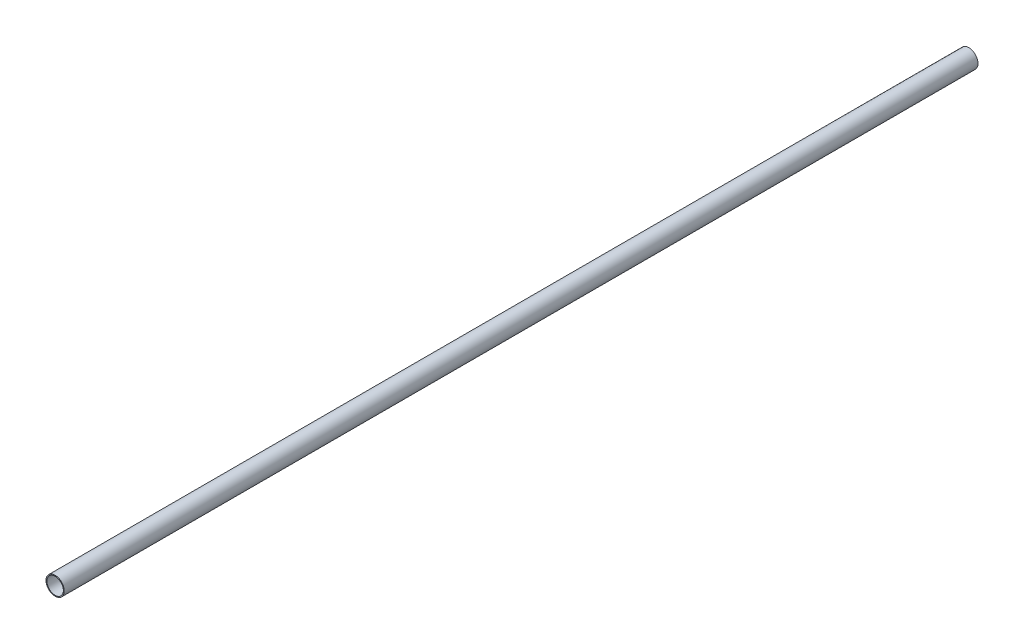
ISO-10303-21;
HEADER;
FILE_DESCRIPTION(('STEP AP214'),'2;1');
FILE_NAME('part.step','',(''),(''),'','','');
FILE_SCHEMA(('AUTOMOTIVE_DESIGN { 1 0 10303 214 1 1 1 1 }'));
ENDSEC;
DATA;
#1=APPLICATION_CONTEXT('core data for automotive mechanical design processes');
#2=APPLICATION_PROTOCOL_DEFINITION('international standard','automotive_design',2000,#1);
#3=PRODUCT_CONTEXT('',#1,'mechanical');
#4=PRODUCT('Part','Part','',(#3));
#5=PRODUCT_RELATED_PRODUCT_CATEGORY('part','',(#4));
#6=PRODUCT_DEFINITION_FORMATION('','',#4);
#7=PRODUCT_DEFINITION_CONTEXT('part definition',#1,'design');
#8=PRODUCT_DEFINITION('design','',#6,#7);
#9=PRODUCT_DEFINITION_SHAPE('','',#8);
#10=(LENGTH_UNIT() NAMED_UNIT(*) SI_UNIT(.MILLI.,.METRE.));
#11=(NAMED_UNIT(*) PLANE_ANGLE_UNIT() SI_UNIT($,.RADIAN.));
#12=(NAMED_UNIT(*) SI_UNIT($,.STERADIAN.) SOLID_ANGLE_UNIT());
#13=UNCERTAINTY_MEASURE_WITH_UNIT(LENGTH_MEASURE(1.E-05),#10,'distance_accuracy_value','');
#14=(GEOMETRIC_REPRESENTATION_CONTEXT(3) GLOBAL_UNCERTAINTY_ASSIGNED_CONTEXT((#13)) GLOBAL_UNIT_ASSIGNED_CONTEXT((#10,
#11,#12)) REPRESENTATION_CONTEXT('',''));
#15=CARTESIAN_POINT('',(0.,0.,0.));
#16=DIRECTION('',(0.,0.,1.));
#17=DIRECTION('',(1.,0.,0.));
#18=AXIS2_PLACEMENT_3D('',#15,#16,#17);
#19=CARTESIAN_POINT('',(0.,0.,1000.));
#20=DIRECTION('',(0.,0.,1.));
#21=DIRECTION('',(1.,0.,0.));
#22=AXIS2_PLACEMENT_3D('',#19,#20,#21);
#23=PLANE('',#22);
#24=CARTESIAN_POINT('',(0.,0.,1000.));
#25=DIRECTION('',(0.,0.,1.));
#26=DIRECTION('',(1.,0.,0.));
#27=AXIS2_PLACEMENT_3D('',#24,#25,#26);
#28=CIRCLE('',#27,10.);
#29=CARTESIAN_POINT('',(10.,0.,1000.));
#30=VERTEX_POINT('',#29);
#31=EDGE_CURVE('E10',#30,#30,#28,.T.);
#32=ORIENTED_EDGE('',*,*,#31,.T.);
#33=EDGE_LOOP('',(#32));
#34=FACE_BOUND('',#33,.T.);
#35=CARTESIAN_POINT('',(0.,0.,1000.));
#36=DIRECTION('',(0.,0.,1.));
#37=DIRECTION('',(1.,0.,0.));
#38=AXIS2_PLACEMENT_3D('',#35,#36,#37);
#39=CIRCLE('',#38,9.);
#40=CARTESIAN_POINT('',(9.,0.,1000.));
#41=VERTEX_POINT('',#40);
#42=EDGE_CURVE('E42',#41,#41,#39,.T.);
#43=ORIENTED_EDGE('',*,*,#42,.F.);
#44=EDGE_LOOP('',(#43));
#45=FACE_BOUND('',#44,.T.);
#46=ADVANCED_FACE('F31',(#34,#45),#23,.T.);
#47=CARTESIAN_POINT('',(0.,0.,0.));
#48=DIRECTION('',(0.,0.,1.));
#49=DIRECTION('',(1.,0.,0.));
#50=AXIS2_PLACEMENT_3D('',#47,#48,#49);
#51=PLANE('',#50);
#52=CARTESIAN_POINT('',(0.,0.,0.));
#53=DIRECTION('',(0.,0.,1.));
#54=DIRECTION('',(1.,0.,0.));
#55=AXIS2_PLACEMENT_3D('',#52,#53,#54);
#56=CIRCLE('',#55,10.);
#57=CARTESIAN_POINT('',(10.,0.,0.));
#58=VERTEX_POINT('',#57);
#59=EDGE_CURVE('E35',#58,#58,#56,.T.);
#60=ORIENTED_EDGE('',*,*,#59,.F.);
#61=EDGE_LOOP('',(#60));
#62=FACE_BOUND('',#61,.T.);
#63=CARTESIAN_POINT('',(0.,0.,0.));
#64=DIRECTION('',(0.,0.,1.));
#65=DIRECTION('',(1.,0.,0.));
#66=AXIS2_PLACEMENT_3D('',#63,#64,#65);
#67=CIRCLE('',#66,9.);
#68=CARTESIAN_POINT('',(9.,0.,0.));
#69=VERTEX_POINT('',#68);
#70=EDGE_CURVE('E44',#69,#69,#67,.T.);
#71=ORIENTED_EDGE('',*,*,#70,.T.);
#72=EDGE_LOOP('',(#71));
#73=FACE_BOUND('',#72,.T.);
#74=ADVANCED_FACE('F54',(#62,#73),#51,.F.);
#75=CARTESIAN_POINT('',(0.,0.,1000.));
#76=DIRECTION('',(0.,0.,-1.));
#77=DIRECTION('',(-1.,0.,0.));
#78=AXIS2_PLACEMENT_3D('',#75,#76,#77);
#79=CYLINDRICAL_SURFACE('',#78,10.);
#80=ORIENTED_EDGE('',*,*,#31,.F.);
#81=EDGE_LOOP('',(#80));
#82=FACE_BOUND('',#81,.T.);
#83=ORIENTED_EDGE('',*,*,#59,.T.);
#84=EDGE_LOOP('',(#83));
#85=FACE_BOUND('',#84,.T.);
#86=ADVANCED_FACE('F33',(#82,#85),#79,.T.);
#87=CARTESIAN_POINT('',(0.,0.,1000.));
#88=DIRECTION('',(0.,0.,-1.));
#89=DIRECTION('',(-1.,0.,0.));
#90=AXIS2_PLACEMENT_3D('',#87,#88,#89);
#91=CYLINDRICAL_SURFACE('',#90,9.);
#92=ORIENTED_EDGE('',*,*,#42,.T.);
#93=EDGE_LOOP('',(#92));
#94=FACE_BOUND('',#93,.T.);
#95=ORIENTED_EDGE('',*,*,#70,.F.);
#96=EDGE_LOOP('',(#95));
#97=FACE_BOUND('',#96,.T.);
#98=ADVANCED_FACE('F50',(#94,#97),#91,.F.);
#99=CLOSED_SHELL('',(#46,#74,#86,#98));
#100=MANIFOLD_SOLID_BREP('B2',#99);
#101=ADVANCED_BREP_SHAPE_REPRESENTATION('',(#18,#100),#14);
#102=SHAPE_DEFINITION_REPRESENTATION(#9,#101);
ENDSEC;
END-ISO-10303-21;
